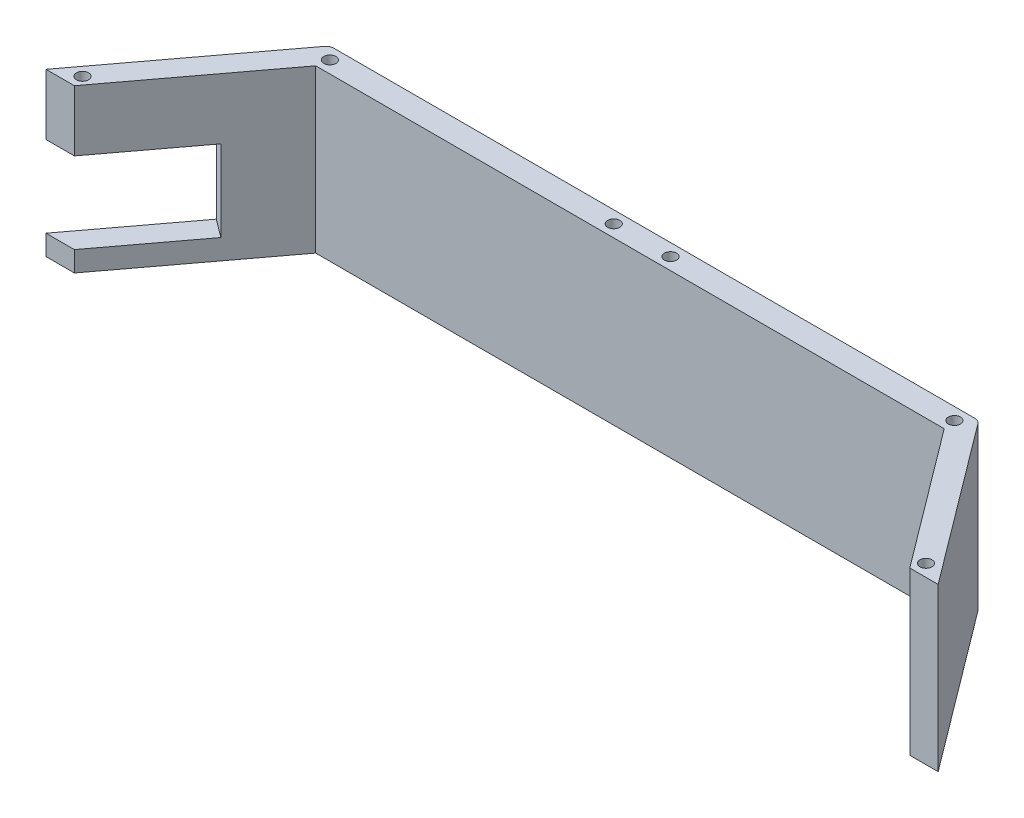
ISO-10303-21;
HEADER;
FILE_DESCRIPTION(('STEP AP214'),'2;1');
FILE_NAME('part.step','',(''),(''),'','','');
FILE_SCHEMA(('AUTOMOTIVE_DESIGN { 1 0 10303 214 1 1 1 1 }'));
ENDSEC;
DATA;
#1=APPLICATION_CONTEXT('core data for automotive mechanical design processes');
#2=APPLICATION_PROTOCOL_DEFINITION('international standard','automotive_design',2000,#1);
#3=PRODUCT_CONTEXT('',#1,'mechanical');
#4=PRODUCT('Part','Part','',(#3));
#5=PRODUCT_RELATED_PRODUCT_CATEGORY('part','',(#4));
#6=PRODUCT_DEFINITION_FORMATION('','',#4);
#7=PRODUCT_DEFINITION_CONTEXT('part definition',#1,'design');
#8=PRODUCT_DEFINITION('design','',#6,#7);
#9=PRODUCT_DEFINITION_SHAPE('','',#8);
#10=(LENGTH_UNIT() NAMED_UNIT(*) SI_UNIT(.MILLI.,.METRE.));
#11=(NAMED_UNIT(*) PLANE_ANGLE_UNIT() SI_UNIT($,.RADIAN.));
#12=(NAMED_UNIT(*) SI_UNIT($,.STERADIAN.) SOLID_ANGLE_UNIT());
#13=UNCERTAINTY_MEASURE_WITH_UNIT(LENGTH_MEASURE(1.E-05),#10,'distance_accuracy_value','');
#14=(GEOMETRIC_REPRESENTATION_CONTEXT(3) GLOBAL_UNCERTAINTY_ASSIGNED_CONTEXT((#13)) GLOBAL_UNIT_ASSIGNED_CONTEXT((#10,
#11,#12)) REPRESENTATION_CONTEXT('',''));
#15=CARTESIAN_POINT('',(0.,0.,0.));
#16=DIRECTION('',(0.,0.,1.));
#17=DIRECTION('',(1.,0.,0.));
#18=AXIS2_PLACEMENT_3D('',#15,#16,#17);
#19=CARTESIAN_POINT('',(-103.,20.,1.75709577940571E-13));
#20=DIRECTION('',(0.,0.,-1.));
#21=DIRECTION('',(-1.,0.,0.));
#22=AXIS2_PLACEMENT_3D('',#19,#20,#21);
#23=PLANE('',#22);
#24=DIRECTION('',(0.,-1.,0.));
#25=VECTOR('',#24,1.);
#26=CARTESIAN_POINT('',(-103.,20.,1.75709577940571E-13));
#27=LINE('',#26,#25);
#28=CARTESIAN_POINT('',(-103.,-15.,1.73472347597681E-13));
#29=VERTEX_POINT('',#28);
#30=CARTESIAN_POINT('',(-103.,-20.,1.75709577940571E-13));
#31=VERTEX_POINT('',#30);
#32=EDGE_CURVE('E182',#29,#31,#27,.T.);
#33=ORIENTED_EDGE('',*,*,#32,.F.);
#34=DIRECTION('',(-1.,0.,0.));
#35=VECTOR('',#34,1.);
#36=CARTESIAN_POINT('',(-103.,-15.,1.75709577940571E-13));
#37=LINE('',#36,#35);
#38=CARTESIAN_POINT('',(-110.,-15.,1.45716771982052E-13));
#39=VERTEX_POINT('',#38);
#40=EDGE_CURVE('E148',#29,#39,#37,.T.);
#41=ORIENTED_EDGE('',*,*,#40,.T.);
#42=DIRECTION('',(0.,-1.,0.));
#43=VECTOR('',#42,1.);
#44=CARTESIAN_POINT('',(-110.,20.,1.76566830699974E-13));
#45=LINE('',#44,#43);
#46=CARTESIAN_POINT('',(-110.,-20.,1.76566830699974E-13));
#47=VERTEX_POINT('',#46);
#48=EDGE_CURVE('E162',#39,#47,#45,.T.);
#49=ORIENTED_EDGE('',*,*,#48,.T.);
#50=DIRECTION('',(1.,0.,0.));
#51=VECTOR('',#50,1.);
#52=CARTESIAN_POINT('',(-103.,-20.,1.75709577940571E-13));
#53=LINE('',#52,#51);
#54=EDGE_CURVE('E229',#47,#31,#53,.T.);
#55=ORIENTED_EDGE('',*,*,#54,.T.);
#56=EDGE_LOOP('',(#33,#41,#49,#55));
#57=FACE_BOUND('',#56,.T.);
#58=ADVANCED_FACE('F36',(#57),#23,.F.);
#59=CARTESIAN_POINT('',(-110.,20.,1.76566830699974E-13));
#60=DIRECTION('',(0.8,0.,0.6));
#61=DIRECTION('',(0.6,0.,-0.8));
#62=AXIS2_PLACEMENT_3D('',#59,#60,#61);
#63=PLANE('',#62);
#64=DIRECTION('',(0.6,0.,-0.8));
#65=VECTOR('',#64,1.);
#66=CARTESIAN_POINT('',(-110.,5.,1.45716771982052E-13));
#67=LINE('',#66,#65);
#68=CARTESIAN_POINT('',(-110.,5.,1.45716771982052E-13));
#69=VERTEX_POINT('',#68);
#70=CARTESIAN_POINT('',(-92.,5.,-23.9999999999998));
#71=VERTEX_POINT('',#70);
#72=EDGE_CURVE('E52',#69,#71,#67,.T.);
#73=ORIENTED_EDGE('',*,*,#72,.F.);
#74=CARTESIAN_POINT('',(-110.,20.,1.76566830699974E-13));
#75=VERTEX_POINT('',#74);
#76=EDGE_CURVE('E153',#75,#69,#45,.T.);
#77=ORIENTED_EDGE('',*,*,#76,.F.);
#78=DIRECTION('',(-0.6,0.,0.8));
#79=VECTOR('',#78,1.);
#80=CARTESIAN_POINT('',(-110.,20.,1.76566830699974E-13));
#81=LINE('',#80,#79);
#82=CARTESIAN_POINT('',(-80.6,20.,-39.1999999999998));
#83=VERTEX_POINT('',#82);
#84=EDGE_CURVE('E169',#83,#75,#81,.T.);
#85=ORIENTED_EDGE('',*,*,#84,.F.);
#86=DIRECTION('',(0.,-1.,0.));
#87=VECTOR('',#86,1.);
#88=CARTESIAN_POINT('',(-80.6,20.,-39.1999999999998));
#89=LINE('',#88,#87);
#90=CARTESIAN_POINT('',(-80.6,-20.,-39.1999999999998));
#91=VERTEX_POINT('',#90);
#92=EDGE_CURVE('E196',#83,#91,#89,.T.);
#93=ORIENTED_EDGE('',*,*,#92,.T.);
#94=DIRECTION('',(-0.6,0.,0.8));
#95=VECTOR('',#94,1.);
#96=CARTESIAN_POINT('',(-110.,-20.,1.76566830699974E-13));
#97=LINE('',#96,#95);
#98=EDGE_CURVE('E168',#91,#47,#97,.T.);
#99=ORIENTED_EDGE('',*,*,#98,.T.);
#100=ORIENTED_EDGE('',*,*,#48,.F.);
#101=DIRECTION('',(-0.6,0.,0.8));
#102=VECTOR('',#101,1.);
#103=CARTESIAN_POINT('',(-110.,-15.,1.45716771982052E-13));
#104=LINE('',#103,#102);
#105=CARTESIAN_POINT('',(-92.,-15.,-23.9999999999999));
#106=VERTEX_POINT('',#105);
#107=EDGE_CURVE('E257',#106,#39,#104,.T.);
#108=ORIENTED_EDGE('',*,*,#107,.F.);
#109=DIRECTION('',(0.,-1.,0.));
#110=VECTOR('',#109,1.);
#111=CARTESIAN_POINT('',(-92.,-15.,-23.9999999999999));
#112=LINE('',#111,#110);
#113=EDGE_CURVE('E160',#71,#106,#112,.T.);
#114=ORIENTED_EDGE('',*,*,#113,.F.);
#115=EDGE_LOOP('',(#73,#77,#85,#93,#99,#100,#108,#114));
#116=FACE_BOUND('',#115,.T.);
#117=ADVANCED_FACE('F155',(#116),#63,.F.);
#118=ORIENTED_EDGE('',*,*,#76,.T.);
#119=DIRECTION('',(1.,0.,0.));
#120=VECTOR('',#119,1.);
#121=CARTESIAN_POINT('',(-103.,5.,1.75709577940571E-13));
#122=LINE('',#121,#120);
#123=CARTESIAN_POINT('',(-103.,5.,1.73472347597681E-13));
#124=VERTEX_POINT('',#123);
#125=EDGE_CURVE('E136',#69,#124,#122,.T.);
#126=ORIENTED_EDGE('',*,*,#125,.T.);
#127=CARTESIAN_POINT('',(-103.,20.,1.75709577940571E-13));
#128=VERTEX_POINT('',#127);
#129=EDGE_CURVE('E185',#128,#124,#27,.T.);
#130=ORIENTED_EDGE('',*,*,#129,.F.);
#131=DIRECTION('',(1.,0.,0.));
#132=VECTOR('',#131,1.);
#133=CARTESIAN_POINT('',(-103.,20.,1.75709577940571E-13));
#134=LINE('',#133,#132);
#135=EDGE_CURVE('E161',#75,#128,#134,.T.);
#136=ORIENTED_EDGE('',*,*,#135,.F.);
#137=EDGE_LOOP('',(#118,#126,#130,#136));
#138=FACE_BOUND('',#137,.T.);
#139=ADVANCED_FACE('F157',(#138),#23,.F.);
#140=CARTESIAN_POINT('',(-77.5,20.,-33.9999999999998));
#141=DIRECTION('',(-0.8,0.,-0.6));
#142=DIRECTION('',(-0.6,0.,0.8));
#143=AXIS2_PLACEMENT_3D('',#140,#141,#142);
#144=PLANE('',#143);
#145=DIRECTION('',(0.,-1.,0.));
#146=VECTOR('',#145,1.);
#147=CARTESIAN_POINT('',(-87.52,20.,-20.6399999999998));
#148=LINE('',#147,#146);
#149=CARTESIAN_POINT('',(-87.52,5.,-20.6399999999998));
#150=VERTEX_POINT('',#149);
#151=CARTESIAN_POINT('',(-87.52,-15.,-20.6399999999998));
#152=VERTEX_POINT('',#151);
#153=EDGE_CURVE('E150',#150,#152,#148,.T.);
#154=ORIENTED_EDGE('',*,*,#153,.T.);
#155=DIRECTION('',(-0.6,0.,0.8));
#156=VECTOR('',#155,1.);
#157=CARTESIAN_POINT('',(-77.5,-15.,-33.9999999999998));
#158=LINE('',#157,#156);
#159=EDGE_CURVE('E11',#152,#29,#158,.T.);
#160=ORIENTED_EDGE('',*,*,#159,.T.);
#161=ORIENTED_EDGE('',*,*,#32,.T.);
#162=DIRECTION('',(0.6,0.,-0.8));
#163=VECTOR('',#162,1.);
#164=CARTESIAN_POINT('',(-77.5,-20.,-33.9999999999998));
#165=LINE('',#164,#163);
#166=CARTESIAN_POINT('',(-77.5,-20.,-33.9999999999998));
#167=VERTEX_POINT('',#166);
#168=EDGE_CURVE('E226',#31,#167,#165,.T.);
#169=ORIENTED_EDGE('',*,*,#168,.T.);
#170=DIRECTION('',(0.,-1.,0.));
#171=VECTOR('',#170,1.);
#172=CARTESIAN_POINT('',(-77.5,20.,-33.9999999999998));
#173=LINE('',#172,#171);
#174=CARTESIAN_POINT('',(-77.5,20.,-33.9999999999998));
#175=VERTEX_POINT('',#174);
#176=EDGE_CURVE('E179',#175,#167,#173,.T.);
#177=ORIENTED_EDGE('',*,*,#176,.F.);
#178=DIRECTION('',(0.6,0.,-0.8));
#179=VECTOR('',#178,1.);
#180=CARTESIAN_POINT('',(-77.5,20.,-33.9999999999998));
#181=LINE('',#180,#179);
#182=EDGE_CURVE('E204',#128,#175,#181,.T.);
#183=ORIENTED_EDGE('',*,*,#182,.F.);
#184=ORIENTED_EDGE('',*,*,#129,.T.);
#185=DIRECTION('',(0.6,0.,-0.8));
#186=VECTOR('',#185,1.);
#187=CARTESIAN_POINT('',(-77.5,4.99999999999999,-33.9999999999998));
#188=LINE('',#187,#186);
#189=EDGE_CURVE('E46',#124,#150,#188,.T.);
#190=ORIENTED_EDGE('',*,*,#189,.T.);
#191=EDGE_LOOP('',(#154,#160,#161,#169,#177,#183,#184,#190));
#192=FACE_BOUND('',#191,.T.);
#193=ADVANCED_FACE('F205',(#192),#144,.F.);
#194=CARTESIAN_POINT('',(77.5,20.,-33.9999999999998));
#195=DIRECTION('',(0.,0.,-1.));
#196=DIRECTION('',(-1.,0.,0.));
#197=AXIS2_PLACEMENT_3D('',#194,#195,#196);
#198=PLANE('',#197);
#199=DIRECTION('',(1.,0.,0.));
#200=VECTOR('',#199,1.);
#201=CARTESIAN_POINT('',(77.5,-20.,-33.9999999999998));
#202=LINE('',#201,#200);
#203=CARTESIAN_POINT('',(77.5,-20.,-33.9999999999998));
#204=VERTEX_POINT('',#203);
#205=EDGE_CURVE('E234',#167,#204,#202,.T.);
#206=ORIENTED_EDGE('',*,*,#205,.T.);
#207=DIRECTION('',(0.,-1.,0.));
#208=VECTOR('',#207,1.);
#209=CARTESIAN_POINT('',(77.5,20.,-33.9999999999998));
#210=LINE('',#209,#208);
#211=CARTESIAN_POINT('',(77.5,20.,-33.9999999999998));
#212=VERTEX_POINT('',#211);
#213=EDGE_CURVE('E171',#212,#204,#210,.T.);
#214=ORIENTED_EDGE('',*,*,#213,.F.);
#215=DIRECTION('',(1.,0.,0.));
#216=VECTOR('',#215,1.);
#217=CARTESIAN_POINT('',(77.5,20.,-33.9999999999998));
#218=LINE('',#217,#216);
#219=EDGE_CURVE('E206',#175,#212,#218,.T.);
#220=ORIENTED_EDGE('',*,*,#219,.F.);
#221=ORIENTED_EDGE('',*,*,#176,.T.);
#222=EDGE_LOOP('',(#206,#214,#220,#221));
#223=FACE_BOUND('',#222,.T.);
#224=ADVANCED_FACE('F335',(#223),#198,.F.);
#225=CARTESIAN_POINT('',(77.5,20.,-33.9999999999998));
#226=DIRECTION('',(0.8,0.,-0.6));
#227=DIRECTION('',(-0.6,0.,-0.8));
#228=AXIS2_PLACEMENT_3D('',#225,#226,#227);
#229=PLANE('',#228);
#230=DIRECTION('',(0.6,0.,0.8));
#231=VECTOR('',#230,1.);
#232=CARTESIAN_POINT('',(77.5,-20.,-33.9999999999998));
#233=LINE('',#232,#231);
#234=CARTESIAN_POINT('',(103.,-20.,1.75709577940571E-13));
#235=VERTEX_POINT('',#234);
#236=EDGE_CURVE('E233',#204,#235,#233,.T.);
#237=ORIENTED_EDGE('',*,*,#236,.T.);
#238=DIRECTION('',(0.,-1.,0.));
#239=VECTOR('',#238,1.);
#240=CARTESIAN_POINT('',(103.,20.,1.75709577940571E-13));
#241=LINE('',#240,#239);
#242=CARTESIAN_POINT('',(103.,20.,1.75709577940571E-13));
#243=VERTEX_POINT('',#242);
#244=EDGE_CURVE('E167',#243,#235,#241,.T.);
#245=ORIENTED_EDGE('',*,*,#244,.F.);
#246=DIRECTION('',(0.6,0.,0.8));
#247=VECTOR('',#246,1.);
#248=CARTESIAN_POINT('',(77.5,20.,-33.9999999999998));
#249=LINE('',#248,#247);
#250=EDGE_CURVE('E217',#212,#243,#249,.T.);
#251=ORIENTED_EDGE('',*,*,#250,.F.);
#252=ORIENTED_EDGE('',*,*,#213,.T.);
#253=EDGE_LOOP('',(#237,#245,#251,#252));
#254=FACE_BOUND('',#253,.T.);
#255=ADVANCED_FACE('F339',(#254),#229,.F.);
#256=CARTESIAN_POINT('',(103.,20.,1.75709577940571E-13));
#257=DIRECTION('',(0.,0.,-1.));
#258=DIRECTION('',(-1.,0.,0.));
#259=AXIS2_PLACEMENT_3D('',#256,#257,#258);
#260=PLANE('',#259);
#261=DIRECTION('',(1.,0.,0.));
#262=VECTOR('',#261,1.);
#263=CARTESIAN_POINT('',(103.,-20.,1.75709577940571E-13));
#264=LINE('',#263,#262);
#265=CARTESIAN_POINT('',(110.,-20.,1.76566830699974E-13));
#266=VERTEX_POINT('',#265);
#267=EDGE_CURVE('E240',#235,#266,#264,.T.);
#268=ORIENTED_EDGE('',*,*,#267,.T.);
#269=DIRECTION('',(0.,-1.,0.));
#270=VECTOR('',#269,1.);
#271=CARTESIAN_POINT('',(110.,20.,1.76566830699974E-13));
#272=LINE('',#271,#270);
#273=CARTESIAN_POINT('',(110.,20.,1.76566830699974E-13));
#274=VERTEX_POINT('',#273);
#275=EDGE_CURVE('E165',#274,#266,#272,.T.);
#276=ORIENTED_EDGE('',*,*,#275,.F.);
#277=DIRECTION('',(1.,0.,0.));
#278=VECTOR('',#277,1.);
#279=CARTESIAN_POINT('',(103.,20.,1.75709577940571E-13));
#280=LINE('',#279,#278);
#281=EDGE_CURVE('E219',#243,#274,#280,.T.);
#282=ORIENTED_EDGE('',*,*,#281,.F.);
#283=ORIENTED_EDGE('',*,*,#244,.T.);
#284=EDGE_LOOP('',(#268,#276,#282,#283));
#285=FACE_BOUND('',#284,.T.);
#286=ADVANCED_FACE('F344',(#285),#260,.F.);
#287=CARTESIAN_POINT('',(110.,20.,1.76566830699974E-13));
#288=DIRECTION('',(-0.8,0.,0.6));
#289=DIRECTION('',(0.6,0.,0.8));
#290=AXIS2_PLACEMENT_3D('',#287,#288,#289);
#291=PLANE('',#290);
#292=DIRECTION('',(-0.6,0.,-0.8));
#293=VECTOR('',#292,1.);
#294=CARTESIAN_POINT('',(110.,-20.,1.76566830699974E-13));
#295=LINE('',#294,#293);
#296=CARTESIAN_POINT('',(80.6,-20.,-39.1999999999998));
#297=VERTEX_POINT('',#296);
#298=EDGE_CURVE('E239',#266,#297,#295,.T.);
#299=ORIENTED_EDGE('',*,*,#298,.T.);
#300=DIRECTION('',(0.,-1.,0.));
#301=VECTOR('',#300,1.);
#302=CARTESIAN_POINT('',(80.6,20.,-39.1999999999998));
#303=LINE('',#302,#301);
#304=CARTESIAN_POINT('',(80.6,20.,-39.1999999999998));
#305=VERTEX_POINT('',#304);
#306=EDGE_CURVE('E194',#297,#305,#303,.F.);
#307=ORIENTED_EDGE('',*,*,#306,.T.);
#308=DIRECTION('',(-0.6,0.,-0.8));
#309=VECTOR('',#308,1.);
#310=CARTESIAN_POINT('',(110.,20.,1.76566830699974E-13));
#311=LINE('',#310,#309);
#312=EDGE_CURVE('E225',#274,#305,#311,.T.);
#313=ORIENTED_EDGE('',*,*,#312,.F.);
#314=ORIENTED_EDGE('',*,*,#275,.T.);
#315=EDGE_LOOP('',(#299,#307,#313,#314));
#316=FACE_BOUND('',#315,.T.);
#317=ADVANCED_FACE('F347',(#316),#291,.F.);
#318=CARTESIAN_POINT('',(-80.,20.,-39.9999999999998));
#319=DIRECTION('',(0.,0.,1.));
#320=DIRECTION('',(1.,0.,0.));
#321=AXIS2_PLACEMENT_3D('',#318,#319,#320);
#322=PLANE('',#321);
#323=DIRECTION('',(-1.,0.,0.));
#324=VECTOR('',#323,1.);
#325=CARTESIAN_POINT('',(-80.,20.,-39.9999999999998));
#326=LINE('',#325,#324);
#327=CARTESIAN_POINT('',(79.,20.,-39.9999999999998));
#328=VERTEX_POINT('',#327);
#329=CARTESIAN_POINT('',(-79.,20.,-39.9999999999998));
#330=VERTEX_POINT('',#329);
#331=EDGE_CURVE('E221',#328,#330,#326,.T.);
#332=ORIENTED_EDGE('',*,*,#331,.F.);
#333=DIRECTION('',(0.,-1.,0.));
#334=VECTOR('',#333,1.);
#335=CARTESIAN_POINT('',(79.,20.,-39.9999999999998));
#336=LINE('',#335,#334);
#337=CARTESIAN_POINT('',(79.,-20.,-39.9999999999998));
#338=VERTEX_POINT('',#337);
#339=EDGE_CURVE('E188',#328,#338,#336,.T.);
#340=ORIENTED_EDGE('',*,*,#339,.T.);
#341=DIRECTION('',(-1.,0.,0.));
#342=VECTOR('',#341,1.);
#343=CARTESIAN_POINT('',(-80.,-20.,-39.9999999999998));
#344=LINE('',#343,#342);
#345=CARTESIAN_POINT('',(-79.,-20.,-39.9999999999998));
#346=VERTEX_POINT('',#345);
#347=EDGE_CURVE('E215',#338,#346,#344,.T.);
#348=ORIENTED_EDGE('',*,*,#347,.T.);
#349=DIRECTION('',(0.,-1.,0.));
#350=VECTOR('',#349,1.);
#351=CARTESIAN_POINT('',(-79.,20.,-39.9999999999998));
#352=LINE('',#351,#350);
#353=EDGE_CURVE('E184',#346,#330,#352,.F.);
#354=ORIENTED_EDGE('',*,*,#353,.T.);
#355=EDGE_LOOP('',(#332,#340,#348,#354));
#356=FACE_BOUND('',#355,.T.);
#357=ADVANCED_FACE('F247',(#356),#322,.F.);
#358=CARTESIAN_POINT('',(0.,20.,0.));
#359=DIRECTION('',(0.,-1.,0.));
#360=DIRECTION('',(0.,0.,-1.));
#361=AXIS2_PLACEMENT_3D('',#358,#359,#360);
#362=PLANE('',#361);
#363=CARTESIAN_POINT('',(-104.,20.,-2.99999999999983));
#364=DIRECTION('',(0.,1.,0.));
#365=DIRECTION('',(0.,0.,1.));
#366=AXIS2_PLACEMENT_3D('',#363,#364,#365);
#367=CIRCLE('',#366,1.5);
#368=CARTESIAN_POINT('',(-104.,20.,-1.49999999999983));
#369=VERTEX_POINT('',#368);
#370=EDGE_CURVE('E272',#369,#369,#367,.T.);
#371=ORIENTED_EDGE('',*,*,#370,.F.);
#372=EDGE_LOOP('',(#371));
#373=FACE_BOUND('',#372,.T.);
#374=CARTESIAN_POINT('',(-77.,20.,-36.9999999999998));
#375=DIRECTION('',(0.,1.,0.));
#376=DIRECTION('',(0.,0.,1.));
#377=AXIS2_PLACEMENT_3D('',#374,#375,#376);
#378=CIRCLE('',#377,1.5);
#379=CARTESIAN_POINT('',(-77.,20.,-35.4999999999998));
#380=VERTEX_POINT('',#379);
#381=EDGE_CURVE('E277',#380,#380,#378,.T.);
#382=ORIENTED_EDGE('',*,*,#381,.F.);
#383=EDGE_LOOP('',(#382));
#384=FACE_BOUND('',#383,.T.);
#385=CARTESIAN_POINT('',(-7.,20.,-36.9999999999998));
#386=DIRECTION('',(0.,1.,0.));
#387=DIRECTION('',(0.,0.,1.));
#388=AXIS2_PLACEMENT_3D('',#385,#386,#387);
#389=CIRCLE('',#388,1.5);
#390=CARTESIAN_POINT('',(-7.,20.,-35.4999999999998));
#391=VERTEX_POINT('',#390);
#392=EDGE_CURVE('E284',#391,#391,#389,.T.);
#393=ORIENTED_EDGE('',*,*,#392,.F.);
#394=EDGE_LOOP('',(#393));
#395=FACE_BOUND('',#394,.T.);
#396=CARTESIAN_POINT('',(7.,20.,-36.9999999999998));
#397=DIRECTION('',(0.,1.,0.));
#398=DIRECTION('',(0.,0.,-1.));
#399=AXIS2_PLACEMENT_3D('',#396,#397,#398);
#400=CIRCLE('',#399,1.5);
#401=CARTESIAN_POINT('',(7.,20.,-38.4999999999998));
#402=VERTEX_POINT('',#401);
#403=EDGE_CURVE('E289',#402,#402,#400,.T.);
#404=ORIENTED_EDGE('',*,*,#403,.F.);
#405=EDGE_LOOP('',(#404));
#406=FACE_BOUND('',#405,.T.);
#407=CARTESIAN_POINT('',(77.,20.,-36.9999999999998));
#408=DIRECTION('',(0.,1.,0.));
#409=DIRECTION('',(0.,0.,-1.));
#410=AXIS2_PLACEMENT_3D('',#407,#408,#409);
#411=CIRCLE('',#410,1.5);
#412=CARTESIAN_POINT('',(77.,20.,-38.4999999999998));
#413=VERTEX_POINT('',#412);
#414=EDGE_CURVE('E294',#413,#413,#411,.T.);
#415=ORIENTED_EDGE('',*,*,#414,.F.);
#416=EDGE_LOOP('',(#415));
#417=FACE_BOUND('',#416,.T.);
#418=CARTESIAN_POINT('',(104.,20.,-2.99999999999983));
#419=DIRECTION('',(0.,1.,0.));
#420=DIRECTION('',(0.,0.,-1.));
#421=AXIS2_PLACEMENT_3D('',#418,#419,#420);
#422=CIRCLE('',#421,1.5);
#423=CARTESIAN_POINT('',(104.,20.,-4.49999999999983));
#424=VERTEX_POINT('',#423);
#425=EDGE_CURVE('E300',#424,#424,#422,.T.);
#426=ORIENTED_EDGE('',*,*,#425,.F.);
#427=EDGE_LOOP('',(#426));
#428=FACE_BOUND('',#427,.T.);
#429=ORIENTED_EDGE('',*,*,#312,.T.);
#430=CARTESIAN_POINT('',(79.,20.,-37.9999999999998));
#431=DIRECTION('',(0.,-1.,0.));
#432=DIRECTION('',(0.,0.,-1.));
#433=AXIS2_PLACEMENT_3D('',#430,#431,#432);
#434=CIRCLE('',#433,2.);
#435=EDGE_CURVE('E198',#305,#328,#434,.F.);
#436=ORIENTED_EDGE('',*,*,#435,.T.);
#437=ORIENTED_EDGE('',*,*,#331,.T.);
#438=CARTESIAN_POINT('',(-79.,20.,-37.9999999999998));
#439=DIRECTION('',(0.,-1.,0.));
#440=DIRECTION('',(0.,0.,-1.));
#441=AXIS2_PLACEMENT_3D('',#438,#439,#440);
#442=CIRCLE('',#441,2.);
#443=EDGE_CURVE('E63',#330,#83,#442,.F.);
#444=ORIENTED_EDGE('',*,*,#443,.T.);
#445=ORIENTED_EDGE('',*,*,#84,.T.);
#446=ORIENTED_EDGE('',*,*,#135,.T.);
#447=ORIENTED_EDGE('',*,*,#182,.T.);
#448=ORIENTED_EDGE('',*,*,#219,.T.);
#449=ORIENTED_EDGE('',*,*,#250,.T.);
#450=ORIENTED_EDGE('',*,*,#281,.T.);
#451=EDGE_LOOP('',(#429,#436,#437,#444,#445,#446,#447,#448,#449,#450));
#452=FACE_BOUND('',#451,.T.);
#453=ADVANCED_FACE('F207',(#373,#384,#395,#406,#417,#428,#452),#362,.F.);
#454=CARTESIAN_POINT('',(0.,-20.,0.));
#455=DIRECTION('',(0.,-1.,0.));
#456=DIRECTION('',(0.,0.,-1.));
#457=AXIS2_PLACEMENT_3D('',#454,#455,#456);
#458=PLANE('',#457);
#459=ORIENTED_EDGE('',*,*,#347,.F.);
#460=CARTESIAN_POINT('',(79.,-20.,-37.9999999999998));
#461=DIRECTION('',(0.,-1.,0.));
#462=DIRECTION('',(0.,0.,-1.));
#463=AXIS2_PLACEMENT_3D('',#460,#461,#462);
#464=CIRCLE('',#463,2.);
#465=EDGE_CURVE('E192',#338,#297,#464,.T.);
#466=ORIENTED_EDGE('',*,*,#465,.T.);
#467=ORIENTED_EDGE('',*,*,#298,.F.);
#468=ORIENTED_EDGE('',*,*,#267,.F.);
#469=ORIENTED_EDGE('',*,*,#236,.F.);
#470=ORIENTED_EDGE('',*,*,#205,.F.);
#471=ORIENTED_EDGE('',*,*,#168,.F.);
#472=ORIENTED_EDGE('',*,*,#54,.F.);
#473=ORIENTED_EDGE('',*,*,#98,.F.);
#474=CARTESIAN_POINT('',(-79.,-20.,-37.9999999999998));
#475=DIRECTION('',(0.,-1.,0.));
#476=DIRECTION('',(0.,0.,-1.));
#477=AXIS2_PLACEMENT_3D('',#474,#475,#476);
#478=CIRCLE('',#477,2.);
#479=EDGE_CURVE('E190',#91,#346,#478,.T.);
#480=ORIENTED_EDGE('',*,*,#479,.T.);
#481=EDGE_LOOP('',(#459,#466,#467,#468,#469,#470,#471,#472,#473,#480));
#482=FACE_BOUND('',#481,.T.);
#483=ADVANCED_FACE('F255',(#482),#458,.T.);
#484=CARTESIAN_POINT('',(104.,15.,-2.99999999999983));
#485=DIRECTION('',(0.,1.,0.));
#486=DIRECTION('',(0.,0.,1.));
#487=AXIS2_PLACEMENT_3D('',#484,#485,#486);
#488=CYLINDRICAL_SURFACE('',#487,1.5);
#489=CARTESIAN_POINT('',(104.,15.,-2.99999999999983));
#490=DIRECTION('',(0.,1.,0.));
#491=DIRECTION('',(0.,0.,-1.));
#492=AXIS2_PLACEMENT_3D('',#489,#490,#491);
#493=CIRCLE('',#492,1.5);
#494=CARTESIAN_POINT('',(104.,15.,-4.49999999999983));
#495=VERTEX_POINT('',#494);
#496=EDGE_CURVE('E212',#495,#495,#493,.T.);
#497=ORIENTED_EDGE('',*,*,#496,.F.);
#498=EDGE_LOOP('',(#497));
#499=FACE_BOUND('',#498,.T.);
#500=ORIENTED_EDGE('',*,*,#425,.T.);
#501=EDGE_LOOP('',(#500));
#502=FACE_BOUND('',#501,.T.);
#503=ADVANCED_FACE('F306',(#499,#502),#488,.F.);
#504=CARTESIAN_POINT('',(104.,15.,-2.99999999999983));
#505=DIRECTION('',(0.,-1.,0.));
#506=DIRECTION('',(0.,0.,-1.));
#507=AXIS2_PLACEMENT_3D('',#504,#505,#506);
#508=PLANE('',#507);
#509=ORIENTED_EDGE('',*,*,#496,.T.);
#510=EDGE_LOOP('',(#509));
#511=FACE_BOUND('',#510,.T.);
#512=ADVANCED_FACE('F308',(#511),#508,.F.);
#513=CARTESIAN_POINT('',(77.,15.,-36.9999999999998));
#514=DIRECTION('',(0.,1.,0.));
#515=DIRECTION('',(0.,0.,1.));
#516=AXIS2_PLACEMENT_3D('',#513,#514,#515);
#517=CYLINDRICAL_SURFACE('',#516,1.5);
#518=CARTESIAN_POINT('',(77.,15.,-36.9999999999998));
#519=DIRECTION('',(0.,1.,0.));
#520=DIRECTION('',(0.,0.,-1.));
#521=AXIS2_PLACEMENT_3D('',#518,#519,#520);
#522=CIRCLE('',#521,1.5);
#523=CARTESIAN_POINT('',(77.,15.,-38.4999999999998));
#524=VERTEX_POINT('',#523);
#525=EDGE_CURVE('E299',#524,#524,#522,.T.);
#526=ORIENTED_EDGE('',*,*,#525,.F.);
#527=EDGE_LOOP('',(#526));
#528=FACE_BOUND('',#527,.T.);
#529=ORIENTED_EDGE('',*,*,#414,.T.);
#530=EDGE_LOOP('',(#529));
#531=FACE_BOUND('',#530,.T.);
#532=ADVANCED_FACE('F312',(#528,#531),#517,.F.);
#533=CARTESIAN_POINT('',(77.,15.,-36.9999999999998));
#534=DIRECTION('',(0.,-1.,0.));
#535=DIRECTION('',(0.,0.,-1.));
#536=AXIS2_PLACEMENT_3D('',#533,#534,#535);
#537=PLANE('',#536);
#538=ORIENTED_EDGE('',*,*,#525,.T.);
#539=EDGE_LOOP('',(#538));
#540=FACE_BOUND('',#539,.T.);
#541=ADVANCED_FACE('F369',(#540),#537,.F.);
#542=CARTESIAN_POINT('',(7.,15.,-36.9999999999998));
#543=DIRECTION('',(0.,1.,0.));
#544=DIRECTION('',(0.,0.,1.));
#545=AXIS2_PLACEMENT_3D('',#542,#543,#544);
#546=CYLINDRICAL_SURFACE('',#545,1.5);
#547=CARTESIAN_POINT('',(7.,15.,-36.9999999999998));
#548=DIRECTION('',(0.,1.,0.));
#549=DIRECTION('',(0.,0.,-1.));
#550=AXIS2_PLACEMENT_3D('',#547,#548,#549);
#551=CIRCLE('',#550,1.5);
#552=CARTESIAN_POINT('',(7.,15.,-38.4999999999998));
#553=VERTEX_POINT('',#552);
#554=EDGE_CURVE('E292',#553,#553,#551,.T.);
#555=ORIENTED_EDGE('',*,*,#554,.F.);
#556=EDGE_LOOP('',(#555));
#557=FACE_BOUND('',#556,.T.);
#558=ORIENTED_EDGE('',*,*,#403,.T.);
#559=EDGE_LOOP('',(#558));
#560=FACE_BOUND('',#559,.T.);
#561=ADVANCED_FACE('F374',(#557,#560),#546,.F.);
#562=CARTESIAN_POINT('',(7.,15.,-36.9999999999998));
#563=DIRECTION('',(0.,-1.,0.));
#564=DIRECTION('',(0.,0.,-1.));
#565=AXIS2_PLACEMENT_3D('',#562,#563,#564);
#566=PLANE('',#565);
#567=ORIENTED_EDGE('',*,*,#554,.T.);
#568=EDGE_LOOP('',(#567));
#569=FACE_BOUND('',#568,.T.);
#570=ADVANCED_FACE('F377',(#569),#566,.F.);
#571=CARTESIAN_POINT('',(-7.,15.,-36.9999999999998));
#572=DIRECTION('',(0.,1.,0.));
#573=DIRECTION('',(0.,0.,1.));
#574=AXIS2_PLACEMENT_3D('',#571,#572,#573);
#575=CYLINDRICAL_SURFACE('',#574,1.5);
#576=CARTESIAN_POINT('',(-7.,15.,-36.9999999999998));
#577=DIRECTION('',(0.,1.,0.));
#578=DIRECTION('',(0.,0.,1.));
#579=AXIS2_PLACEMENT_3D('',#576,#577,#578);
#580=CIRCLE('',#579,1.5);
#581=CARTESIAN_POINT('',(-7.,15.,-35.4999999999998));
#582=VERTEX_POINT('',#581);
#583=EDGE_CURVE('E281',#582,#582,#580,.T.);
#584=ORIENTED_EDGE('',*,*,#583,.F.);
#585=EDGE_LOOP('',(#584));
#586=FACE_BOUND('',#585,.T.);
#587=ORIENTED_EDGE('',*,*,#392,.T.);
#588=EDGE_LOOP('',(#587));
#589=FACE_BOUND('',#588,.T.);
#590=ADVANCED_FACE('F385',(#586,#589),#575,.F.);
#591=CARTESIAN_POINT('',(-7.,15.,-36.9999999999998));
#592=DIRECTION('',(0.,1.,0.));
#593=DIRECTION('',(0.,0.,1.));
#594=AXIS2_PLACEMENT_3D('',#591,#592,#593);
#595=PLANE('',#594);
#596=ORIENTED_EDGE('',*,*,#583,.T.);
#597=EDGE_LOOP('',(#596));
#598=FACE_BOUND('',#597,.T.);
#599=ADVANCED_FACE('F390',(#598),#595,.T.);
#600=CARTESIAN_POINT('',(-77.,15.,-36.9999999999998));
#601=DIRECTION('',(0.,1.,0.));
#602=DIRECTION('',(0.,0.,1.));
#603=AXIS2_PLACEMENT_3D('',#600,#601,#602);
#604=CYLINDRICAL_SURFACE('',#603,1.5);
#605=CARTESIAN_POINT('',(-77.,15.,-36.9999999999998));
#606=DIRECTION('',(0.,1.,0.));
#607=DIRECTION('',(0.,0.,1.));
#608=AXIS2_PLACEMENT_3D('',#605,#606,#607);
#609=CIRCLE('',#608,1.5);
#610=CARTESIAN_POINT('',(-77.,15.,-35.4999999999998));
#611=VERTEX_POINT('',#610);
#612=EDGE_CURVE('E276',#611,#611,#609,.T.);
#613=ORIENTED_EDGE('',*,*,#612,.F.);
#614=EDGE_LOOP('',(#613));
#615=FACE_BOUND('',#614,.T.);
#616=ORIENTED_EDGE('',*,*,#381,.T.);
#617=EDGE_LOOP('',(#616));
#618=FACE_BOUND('',#617,.T.);
#619=ADVANCED_FACE('F388',(#615,#618),#604,.F.);
#620=CARTESIAN_POINT('',(-77.,15.,-36.9999999999998));
#621=DIRECTION('',(0.,1.,0.));
#622=DIRECTION('',(0.,0.,1.));
#623=AXIS2_PLACEMENT_3D('',#620,#621,#622);
#624=PLANE('',#623);
#625=ORIENTED_EDGE('',*,*,#612,.T.);
#626=EDGE_LOOP('',(#625));
#627=FACE_BOUND('',#626,.T.);
#628=ADVANCED_FACE('F391',(#627),#624,.T.);
#629=CARTESIAN_POINT('',(-104.,15.,-2.99999999999983));
#630=DIRECTION('',(0.,1.,0.));
#631=DIRECTION('',(0.,0.,1.));
#632=AXIS2_PLACEMENT_3D('',#629,#630,#631);
#633=CYLINDRICAL_SURFACE('',#632,1.5);
#634=CARTESIAN_POINT('',(-104.,15.,-2.99999999999983));
#635=DIRECTION('',(0.,1.,0.));
#636=DIRECTION('',(0.,0.,1.));
#637=AXIS2_PLACEMENT_3D('',#634,#635,#636);
#638=CIRCLE('',#637,1.5);
#639=CARTESIAN_POINT('',(-104.,15.,-1.49999999999983));
#640=VERTEX_POINT('',#639);
#641=EDGE_CURVE('E232',#640,#640,#638,.T.);
#642=ORIENTED_EDGE('',*,*,#641,.F.);
#643=EDGE_LOOP('',(#642));
#644=FACE_BOUND('',#643,.T.);
#645=ORIENTED_EDGE('',*,*,#370,.T.);
#646=EDGE_LOOP('',(#645));
#647=FACE_BOUND('',#646,.T.);
#648=ADVANCED_FACE('F399',(#644,#647),#633,.F.);
#649=CARTESIAN_POINT('',(-104.,15.,-2.99999999999983));
#650=DIRECTION('',(0.,1.,0.));
#651=DIRECTION('',(0.,0.,1.));
#652=AXIS2_PLACEMENT_3D('',#649,#650,#651);
#653=PLANE('',#652);
#654=ORIENTED_EDGE('',*,*,#641,.T.);
#655=EDGE_LOOP('',(#654));
#656=FACE_BOUND('',#655,.T.);
#657=ADVANCED_FACE('F403',(#656),#653,.T.);
#658=CARTESIAN_POINT('',(79.,20.,-37.9999999999998));
#659=DIRECTION('',(0.,-1.,0.));
#660=DIRECTION('',(0.,0.,-1.));
#661=AXIS2_PLACEMENT_3D('',#658,#659,#660);
#662=CYLINDRICAL_SURFACE('',#661,2.);
#663=ORIENTED_EDGE('',*,*,#435,.F.);
#664=ORIENTED_EDGE('',*,*,#306,.F.);
#665=ORIENTED_EDGE('',*,*,#465,.F.);
#666=ORIENTED_EDGE('',*,*,#339,.F.);
#667=EDGE_LOOP('',(#663,#664,#665,#666));
#668=FACE_BOUND('',#667,.T.);
#669=ADVANCED_FACE('F410',(#668),#662,.T.);
#670=CARTESIAN_POINT('',(-79.,20.,-37.9999999999998));
#671=DIRECTION('',(0.,-1.,0.));
#672=DIRECTION('',(0.,0.,-1.));
#673=AXIS2_PLACEMENT_3D('',#670,#671,#672);
#674=CYLINDRICAL_SURFACE('',#673,2.);
#675=ORIENTED_EDGE('',*,*,#443,.F.);
#676=ORIENTED_EDGE('',*,*,#353,.F.);
#677=ORIENTED_EDGE('',*,*,#479,.F.);
#678=ORIENTED_EDGE('',*,*,#92,.F.);
#679=EDGE_LOOP('',(#675,#676,#677,#678));
#680=FACE_BOUND('',#679,.T.);
#681=ADVANCED_FACE('F37',(#680),#674,.T.);
#682=CARTESIAN_POINT('',(-102.,-15.,6.00000000000014));
#683=DIRECTION('',(0.,-1.,0.));
#684=DIRECTION('',(0.,0.,-1.));
#685=AXIS2_PLACEMENT_3D('',#682,#683,#684);
#686=PLANE('',#685);
#687=ORIENTED_EDGE('',*,*,#159,.F.);
#688=DIRECTION('',(-0.8,0.,-0.6));
#689=VECTOR('',#688,1.);
#690=CARTESIAN_POINT('',(-84.,-15.,-17.9999999999999));
#691=LINE('',#690,#689);
#692=EDGE_CURVE('E262',#152,#106,#691,.T.);
#693=ORIENTED_EDGE('',*,*,#692,.T.);
#694=ORIENTED_EDGE('',*,*,#107,.T.);
#695=ORIENTED_EDGE('',*,*,#40,.F.);
#696=EDGE_LOOP('',(#687,#693,#694,#695));
#697=FACE_BOUND('',#696,.T.);
#698=ADVANCED_FACE('F411',(#697),#686,.F.);
#699=CARTESIAN_POINT('',(-102.,5.,6.00000000000014));
#700=DIRECTION('',(0.,1.,0.));
#701=DIRECTION('',(0.,0.,1.));
#702=AXIS2_PLACEMENT_3D('',#699,#700,#701);
#703=PLANE('',#702);
#704=ORIENTED_EDGE('',*,*,#72,.T.);
#705=DIRECTION('',(-0.8,0.,-0.6));
#706=VECTOR('',#705,1.);
#707=CARTESIAN_POINT('',(-84.,5.,-17.9999999999999));
#708=LINE('',#707,#706);
#709=EDGE_CURVE('E265',#150,#71,#708,.T.);
#710=ORIENTED_EDGE('',*,*,#709,.F.);
#711=ORIENTED_EDGE('',*,*,#189,.F.);
#712=ORIENTED_EDGE('',*,*,#125,.F.);
#713=EDGE_LOOP('',(#704,#710,#711,#712));
#714=FACE_BOUND('',#713,.T.);
#715=ADVANCED_FACE('F138',(#714),#703,.F.);
#716=CARTESIAN_POINT('',(-84.,-15.,-17.9999999999999));
#717=DIRECTION('',(0.6,0.,-0.8));
#718=DIRECTION('',(-0.8,0.,-0.6));
#719=AXIS2_PLACEMENT_3D('',#716,#717,#718);
#720=PLANE('',#719);
#721=ORIENTED_EDGE('',*,*,#709,.T.);
#722=ORIENTED_EDGE('',*,*,#113,.T.);
#723=ORIENTED_EDGE('',*,*,#692,.F.);
#724=ORIENTED_EDGE('',*,*,#153,.F.);
#725=EDGE_LOOP('',(#721,#722,#723,#724));
#726=FACE_BOUND('',#725,.T.);
#727=ADVANCED_FACE('F414',(#726),#720,.F.);
#728=CLOSED_SHELL('',(#58,#117,#139,#193,#224,#255,#286,#317,#357,#453,#483,#503,#512,#532,#541,
#561,#570,#590,#599,#619,#628,#648,#657,#669,#681,#698,#715,#727));
#729=MANIFOLD_SOLID_BREP('B2',#728);
#730=ADVANCED_BREP_SHAPE_REPRESENTATION('',(#18,#729),#14);
#731=SHAPE_DEFINITION_REPRESENTATION(#9,#730);
ENDSEC;
END-ISO-10303-21;
